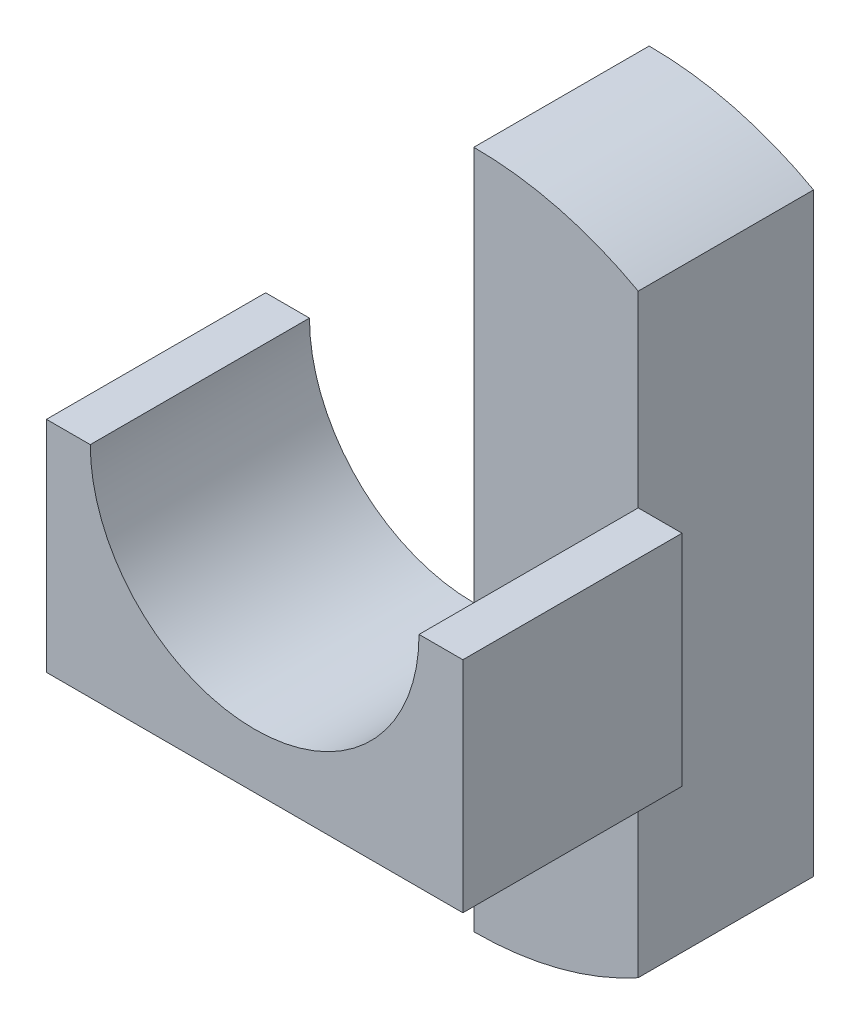
ISO-10303-21;
HEADER;
FILE_DESCRIPTION(('STEP AP214'),'2;1');
FILE_NAME('part.step','',(''),(''),'','','');
FILE_SCHEMA(('AUTOMOTIVE_DESIGN { 1 0 10303 214 1 1 1 1 }'));
ENDSEC;
DATA;
#1=APPLICATION_CONTEXT('core data for automotive mechanical design processes');
#2=APPLICATION_PROTOCOL_DEFINITION('international standard','automotive_design',2000,#1);
#3=PRODUCT_CONTEXT('',#1,'mechanical');
#4=PRODUCT('Part','Part','',(#3));
#5=PRODUCT_RELATED_PRODUCT_CATEGORY('part','',(#4));
#6=PRODUCT_DEFINITION_FORMATION('','',#4);
#7=PRODUCT_DEFINITION_CONTEXT('part definition',#1,'design');
#8=PRODUCT_DEFINITION('design','',#6,#7);
#9=PRODUCT_DEFINITION_SHAPE('','',#8);
#10=(LENGTH_UNIT() NAMED_UNIT(*) SI_UNIT(.MILLI.,.METRE.));
#11=(NAMED_UNIT(*) PLANE_ANGLE_UNIT() SI_UNIT($,.RADIAN.));
#12=(NAMED_UNIT(*) SI_UNIT($,.STERADIAN.) SOLID_ANGLE_UNIT());
#13=UNCERTAINTY_MEASURE_WITH_UNIT(LENGTH_MEASURE(1.E-05),#10,'distance_accuracy_value','');
#14=(GEOMETRIC_REPRESENTATION_CONTEXT(3) GLOBAL_UNCERTAINTY_ASSIGNED_CONTEXT((#13)) GLOBAL_UNIT_ASSIGNED_CONTEXT((#10,
#11,#12)) REPRESENTATION_CONTEXT('',''));
#15=CARTESIAN_POINT('',(0.,0.,0.));
#16=DIRECTION('',(0.,0.,1.));
#17=DIRECTION('',(1.,0.,0.));
#18=AXIS2_PLACEMENT_3D('',#15,#16,#17);
#19=CARTESIAN_POINT('',(0.,0.,8.));
#20=DIRECTION('',(0.,0.,-1.));
#21=DIRECTION('',(-1.,0.,0.));
#22=AXIS2_PLACEMENT_3D('',#19,#20,#21);
#23=PLANE('',#22);
#24=DIRECTION('',(1.,0.,0.));
#25=VECTOR('',#24,1.);
#26=CARTESIAN_POINT('',(0.,-5.,8.));
#27=LINE('',#26,#25);
#28=CARTESIAN_POINT('',(0.,-5.,8.));
#29=VERTEX_POINT('',#28);
#30=CARTESIAN_POINT('',(7.50000000000001,-5.,8.));
#31=VERTEX_POINT('',#30);
#32=EDGE_CURVE('E11',#29,#31,#27,.T.);
#33=ORIENTED_EDGE('',*,*,#32,.F.);
#34=DIRECTION('',(0.,-1.,0.));
#35=VECTOR('',#34,1.);
#36=CARTESIAN_POINT('',(0.,15.5,8.));
#37=LINE('',#36,#35);
#38=CARTESIAN_POINT('',(0.,-15.5,8.));
#39=VERTEX_POINT('',#38);
#40=EDGE_CURVE('E63',#29,#39,#37,.T.);
#41=ORIENTED_EDGE('',*,*,#40,.T.);
#42=CARTESIAN_POINT('',(0.,0.,8.));
#43=DIRECTION('',(0.,0.,1.));
#44=DIRECTION('',(-1.,0.,0.));
#45=AXIS2_PLACEMENT_3D('',#42,#43,#44);
#46=CIRCLE('',#45,15.5);
#47=CARTESIAN_POINT('',(7.50000000000001,-13.5646599662505,8.));
#48=VERTEX_POINT('',#47);
#49=EDGE_CURVE('E169',#39,#48,#46,.T.);
#50=ORIENTED_EDGE('',*,*,#49,.T.);
#51=DIRECTION('',(0.,1.,0.));
#52=VECTOR('',#51,1.);
#53=CARTESIAN_POINT('',(7.50000000000001,-13.5646599662505,8.));
#54=LINE('',#53,#52);
#55=EDGE_CURVE('E93',#48,#31,#54,.T.);
#56=ORIENTED_EDGE('',*,*,#55,.T.);
#57=EDGE_LOOP('',(#33,#41,#50,#56));
#58=FACE_BOUND('',#57,.T.);
#59=ADVANCED_FACE('F35',(#58),#23,.F.);
#60=CARTESIAN_POINT('',(0.,0.,8.));
#61=DIRECTION('',(0.,0.,-1.));
#62=DIRECTION('',(-1.,0.,0.));
#63=AXIS2_PLACEMENT_3D('',#60,#61,#62);
#64=CYLINDRICAL_SURFACE('',#63,15.5);
#65=CARTESIAN_POINT('',(0.,0.,0.));
#66=DIRECTION('',(0.,0.,1.));
#67=DIRECTION('',(-1.,0.,0.));
#68=AXIS2_PLACEMENT_3D('',#65,#66,#67);
#69=CIRCLE('',#68,15.5);
#70=CARTESIAN_POINT('',(0.,-15.5,0.));
#71=VERTEX_POINT('',#70);
#72=CARTESIAN_POINT('',(7.50000000000001,-13.5646599662505,0.));
#73=VERTEX_POINT('',#72);
#74=EDGE_CURVE('E160',#71,#73,#69,.T.);
#75=ORIENTED_EDGE('',*,*,#74,.T.);
#76=DIRECTION('',(0.,0.,-1.));
#77=VECTOR('',#76,1.);
#78=CARTESIAN_POINT('',(7.50000000000001,-13.5646599662505,8.));
#79=LINE('',#78,#77);
#80=EDGE_CURVE('E39',#48,#73,#79,.T.);
#81=ORIENTED_EDGE('',*,*,#80,.F.);
#82=ORIENTED_EDGE('',*,*,#49,.F.);
#83=DIRECTION('',(0.,0.,-1.));
#84=VECTOR('',#83,1.);
#85=CARTESIAN_POINT('',(0.,-15.5,8.));
#86=LINE('',#85,#84);
#87=EDGE_CURVE('E178',#39,#71,#86,.T.);
#88=ORIENTED_EDGE('',*,*,#87,.T.);
#89=EDGE_LOOP('',(#75,#81,#82,#88));
#90=FACE_BOUND('',#89,.T.);
#91=ADVANCED_FACE('F37',(#90),#64,.T.);
#92=CARTESIAN_POINT('',(7.50000000000001,-13.5646599662505,8.));
#93=DIRECTION('',(-1.,0.,0.));
#94=DIRECTION('',(0.,-1.,0.));
#95=AXIS2_PLACEMENT_3D('',#92,#93,#94);
#96=PLANE('',#95);
#97=DIRECTION('',(0.,1.,0.));
#98=VECTOR('',#97,1.);
#99=CARTESIAN_POINT('',(7.50000000000001,-13.5646599662505,0.));
#100=LINE('',#99,#98);
#101=CARTESIAN_POINT('',(7.50000000000001,13.5646599662505,0.));
#102=VERTEX_POINT('',#101);
#103=EDGE_CURVE('E163',#73,#102,#100,.T.);
#104=ORIENTED_EDGE('',*,*,#103,.T.);
#105=DIRECTION('',(0.,0.,-1.));
#106=VECTOR('',#105,1.);
#107=CARTESIAN_POINT('',(7.50000000000001,13.5646599662505,8.));
#108=LINE('',#107,#106);
#109=CARTESIAN_POINT('',(7.50000000000001,13.5646599662505,8.));
#110=VERTEX_POINT('',#109);
#111=EDGE_CURVE('E187',#110,#102,#108,.T.);
#112=ORIENTED_EDGE('',*,*,#111,.F.);
#113=CARTESIAN_POINT('',(7.50000000000001,5.,8.));
#114=VERTEX_POINT('',#113);
#115=EDGE_CURVE('E171',#114,#110,#54,.T.);
#116=ORIENTED_EDGE('',*,*,#115,.F.);
#117=EDGE_CURVE('E174',#31,#114,#54,.T.);
#118=ORIENTED_EDGE('',*,*,#117,.F.);
#119=ORIENTED_EDGE('',*,*,#55,.F.);
#120=ORIENTED_EDGE('',*,*,#80,.T.);
#121=EDGE_LOOP('',(#104,#112,#116,#118,#119,#120));
#122=FACE_BOUND('',#121,.T.);
#123=ADVANCED_FACE('F242',(#122),#96,.F.);
#124=CARTESIAN_POINT('',(0.,0.,8.));
#125=DIRECTION('',(0.,0.,-1.));
#126=DIRECTION('',(-1.,0.,0.));
#127=AXIS2_PLACEMENT_3D('',#124,#125,#126);
#128=CYLINDRICAL_SURFACE('',#127,15.5);
#129=CARTESIAN_POINT('',(0.,0.,0.));
#130=DIRECTION('',(0.,0.,1.));
#131=DIRECTION('',(-1.,0.,0.));
#132=AXIS2_PLACEMENT_3D('',#129,#130,#131);
#133=CIRCLE('',#132,15.5);
#134=CARTESIAN_POINT('',(0.,15.5,0.));
#135=VERTEX_POINT('',#134);
#136=EDGE_CURVE('E182',#102,#135,#133,.T.);
#137=ORIENTED_EDGE('',*,*,#136,.T.);
#138=DIRECTION('',(0.,0.,-1.));
#139=VECTOR('',#138,1.);
#140=CARTESIAN_POINT('',(0.,15.5,8.));
#141=LINE('',#140,#139);
#142=CARTESIAN_POINT('',(0.,15.5,8.));
#143=VERTEX_POINT('',#142);
#144=EDGE_CURVE('E186',#143,#135,#141,.T.);
#145=ORIENTED_EDGE('',*,*,#144,.F.);
#146=CARTESIAN_POINT('',(0.,0.,8.));
#147=DIRECTION('',(0.,0.,1.));
#148=DIRECTION('',(-1.,0.,0.));
#149=AXIS2_PLACEMENT_3D('',#146,#147,#148);
#150=CIRCLE('',#149,15.5);
#151=EDGE_CURVE('E173',#110,#143,#150,.T.);
#152=ORIENTED_EDGE('',*,*,#151,.F.);
#153=ORIENTED_EDGE('',*,*,#111,.T.);
#154=EDGE_LOOP('',(#137,#145,#152,#153));
#155=FACE_BOUND('',#154,.T.);
#156=ADVANCED_FACE('F243',(#155),#128,.T.);
#157=CARTESIAN_POINT('',(0.,15.5,8.));
#158=DIRECTION('',(1.,0.,0.));
#159=DIRECTION('',(0.,1.,0.));
#160=AXIS2_PLACEMENT_3D('',#157,#158,#159);
#161=PLANE('',#160);
#162=DIRECTION('',(0.,-1.,0.));
#163=VECTOR('',#162,1.);
#164=CARTESIAN_POINT('',(0.,15.5,0.));
#165=LINE('',#164,#163);
#166=EDGE_CURVE('E85',#135,#71,#165,.T.);
#167=ORIENTED_EDGE('',*,*,#166,.T.);
#168=ORIENTED_EDGE('',*,*,#87,.F.);
#169=ORIENTED_EDGE('',*,*,#40,.F.);
#170=CARTESIAN_POINT('',(0.,-2.5,8.));
#171=VERTEX_POINT('',#170);
#172=EDGE_CURVE('E179',#171,#29,#37,.T.);
#173=ORIENTED_EDGE('',*,*,#172,.F.);
#174=EDGE_CURVE('E176',#143,#171,#37,.T.);
#175=ORIENTED_EDGE('',*,*,#174,.F.);
#176=ORIENTED_EDGE('',*,*,#144,.T.);
#177=EDGE_LOOP('',(#167,#168,#169,#173,#175,#176));
#178=FACE_BOUND('',#177,.T.);
#179=ADVANCED_FACE('F245',(#178),#161,.F.);
#180=ORIENTED_EDGE('',*,*,#174,.T.);
#181=CARTESIAN_POINT('',(0.,5.,8.));
#182=DIRECTION('',(0.,0.,1.));
#183=DIRECTION('',(1.,0.,0.));
#184=AXIS2_PLACEMENT_3D('',#181,#182,#183);
#185=CIRCLE('',#184,7.5);
#186=EDGE_CURVE('E44',#171,#114,#185,.T.);
#187=ORIENTED_EDGE('',*,*,#186,.T.);
#188=ORIENTED_EDGE('',*,*,#115,.T.);
#189=ORIENTED_EDGE('',*,*,#151,.T.);
#190=EDGE_LOOP('',(#180,#187,#188,#189));
#191=FACE_BOUND('',#190,.T.);
#192=ADVANCED_FACE('F240',(#191),#23,.F.);
#193=CARTESIAN_POINT('',(0.,0.,0.));
#194=DIRECTION('',(0.,0.,-1.));
#195=DIRECTION('',(-1.,0.,0.));
#196=AXIS2_PLACEMENT_3D('',#193,#194,#195);
#197=PLANE('',#196);
#198=ORIENTED_EDGE('',*,*,#74,.F.);
#199=ORIENTED_EDGE('',*,*,#166,.F.);
#200=ORIENTED_EDGE('',*,*,#136,.F.);
#201=ORIENTED_EDGE('',*,*,#103,.F.);
#202=EDGE_LOOP('',(#198,#199,#200,#201));
#203=FACE_BOUND('',#202,.T.);
#204=ADVANCED_FACE('F251',(#203),#197,.T.);
#205=CARTESIAN_POINT('',(0.,0.,8.));
#206=DIRECTION('',(0.,0.,1.));
#207=DIRECTION('',(1.,0.,0.));
#208=AXIS2_PLACEMENT_3D('',#205,#206,#207);
#209=PLANE('',#208);
#210=CARTESIAN_POINT('',(9.50000000000001,-5.,8.));
#211=VERTEX_POINT('',#210);
#212=EDGE_CURVE('E47',#31,#211,#27,.T.);
#213=ORIENTED_EDGE('',*,*,#212,.F.);
#214=ORIENTED_EDGE('',*,*,#117,.T.);
#215=DIRECTION('',(-1.,0.,0.));
#216=VECTOR('',#215,1.);
#217=CARTESIAN_POINT('',(0.,5.,8.));
#218=LINE('',#217,#216);
#219=CARTESIAN_POINT('',(9.50000000000001,5.,8.));
#220=VERTEX_POINT('',#219);
#221=EDGE_CURVE('E54',#220,#114,#218,.T.);
#222=ORIENTED_EDGE('',*,*,#221,.F.);
#223=DIRECTION('',(0.,1.,0.));
#224=VECTOR('',#223,1.);
#225=CARTESIAN_POINT('',(9.50000000000001,0.,8.));
#226=LINE('',#225,#224);
#227=EDGE_CURVE('E159',#211,#220,#226,.T.);
#228=ORIENTED_EDGE('',*,*,#227,.F.);
#229=EDGE_LOOP('',(#213,#214,#222,#228));
#230=FACE_BOUND('',#229,.T.);
#231=ADVANCED_FACE('F239',(#230),#209,.F.);
#232=CARTESIAN_POINT('',(-7.5,5.,8.));
#233=VERTEX_POINT('',#232);
#234=EDGE_CURVE('E196',#233,#171,#185,.T.);
#235=ORIENTED_EDGE('',*,*,#234,.T.);
#236=ORIENTED_EDGE('',*,*,#172,.T.);
#237=CARTESIAN_POINT('',(-9.5,-5.,8.));
#238=VERTEX_POINT('',#237);
#239=EDGE_CURVE('E46',#238,#29,#27,.T.);
#240=ORIENTED_EDGE('',*,*,#239,.F.);
#241=DIRECTION('',(0.,1.,0.));
#242=VECTOR('',#241,1.);
#243=CARTESIAN_POINT('',(-9.5,0.,8.));
#244=LINE('',#243,#242);
#245=CARTESIAN_POINT('',(-9.50000000000001,5.,8.));
#246=VERTEX_POINT('',#245);
#247=EDGE_CURVE('E207',#238,#246,#244,.T.);
#248=ORIENTED_EDGE('',*,*,#247,.T.);
#249=DIRECTION('',(1.,0.,0.));
#250=VECTOR('',#249,1.);
#251=CARTESIAN_POINT('',(0.,5.,8.));
#252=LINE('',#251,#250);
#253=EDGE_CURVE('E202',#246,#233,#252,.T.);
#254=ORIENTED_EDGE('',*,*,#253,.T.);
#255=EDGE_LOOP('',(#235,#236,#240,#248,#254));
#256=FACE_BOUND('',#255,.T.);
#257=ADVANCED_FACE('F246',(#256),#209,.F.);
#258=CARTESIAN_POINT('',(9.50000000000001,0.,18.));
#259=DIRECTION('',(-1.,0.,0.));
#260=DIRECTION('',(0.,0.,1.));
#261=AXIS2_PLACEMENT_3D('',#258,#259,#260);
#262=PLANE('',#261);
#263=ORIENTED_EDGE('',*,*,#227,.T.);
#264=DIRECTION('',(0.,0.,-1.));
#265=VECTOR('',#264,1.);
#266=CARTESIAN_POINT('',(9.50000000000001,5.,18.));
#267=LINE('',#266,#265);
#268=CARTESIAN_POINT('',(9.50000000000001,5.,18.));
#269=VERTEX_POINT('',#268);
#270=EDGE_CURVE('E139',#269,#220,#267,.T.);
#271=ORIENTED_EDGE('',*,*,#270,.F.);
#272=DIRECTION('',(0.,1.,0.));
#273=VECTOR('',#272,1.);
#274=CARTESIAN_POINT('',(9.50000000000001,0.,18.));
#275=LINE('',#274,#273);
#276=CARTESIAN_POINT('',(9.50000000000001,-5.,18.));
#277=VERTEX_POINT('',#276);
#278=EDGE_CURVE('E146',#277,#269,#275,.T.);
#279=ORIENTED_EDGE('',*,*,#278,.F.);
#280=DIRECTION('',(0.,0.,-1.));
#281=VECTOR('',#280,1.);
#282=CARTESIAN_POINT('',(9.50000000000001,-5.,18.));
#283=LINE('',#282,#281);
#284=EDGE_CURVE('E211',#277,#211,#283,.T.);
#285=ORIENTED_EDGE('',*,*,#284,.T.);
#286=EDGE_LOOP('',(#263,#271,#279,#285));
#287=FACE_BOUND('',#286,.T.);
#288=ADVANCED_FACE('F157',(#287),#262,.F.);
#289=CARTESIAN_POINT('',(0.,5.,18.));
#290=DIRECTION('',(0.,-1.,0.));
#291=DIRECTION('',(0.,0.,-1.));
#292=AXIS2_PLACEMENT_3D('',#289,#290,#291);
#293=PLANE('',#292);
#294=ORIENTED_EDGE('',*,*,#221,.T.);
#295=DIRECTION('',(0.,0.,-1.));
#296=VECTOR('',#295,1.);
#297=CARTESIAN_POINT('',(7.50000000000001,5.,18.));
#298=LINE('',#297,#296);
#299=CARTESIAN_POINT('',(7.50000000000001,5.,18.));
#300=VERTEX_POINT('',#299);
#301=EDGE_CURVE('E141',#300,#114,#298,.T.);
#302=ORIENTED_EDGE('',*,*,#301,.F.);
#303=DIRECTION('',(-1.,0.,0.));
#304=VECTOR('',#303,1.);
#305=CARTESIAN_POINT('',(0.,5.,18.));
#306=LINE('',#305,#304);
#307=EDGE_CURVE('E135',#269,#300,#306,.T.);
#308=ORIENTED_EDGE('',*,*,#307,.F.);
#309=ORIENTED_EDGE('',*,*,#270,.T.);
#310=EDGE_LOOP('',(#294,#302,#308,#309));
#311=FACE_BOUND('',#310,.T.);
#312=ADVANCED_FACE('F137',(#311),#293,.F.);
#313=CARTESIAN_POINT('',(0.,5.,18.));
#314=DIRECTION('',(0.,0.,-1.));
#315=DIRECTION('',(-1.,0.,0.));
#316=AXIS2_PLACEMENT_3D('',#313,#314,#315);
#317=CYLINDRICAL_SURFACE('',#316,7.5);
#318=ORIENTED_EDGE('',*,*,#234,.F.);
#319=DIRECTION('',(0.,0.,-1.));
#320=VECTOR('',#319,1.);
#321=CARTESIAN_POINT('',(-7.5,5.,18.));
#322=LINE('',#321,#320);
#323=CARTESIAN_POINT('',(-7.5,5.,18.));
#324=VERTEX_POINT('',#323);
#325=EDGE_CURVE('E165',#324,#233,#322,.T.);
#326=ORIENTED_EDGE('',*,*,#325,.F.);
#327=CARTESIAN_POINT('',(0.,5.,18.));
#328=DIRECTION('',(0.,0.,1.));
#329=DIRECTION('',(1.,0.,0.));
#330=AXIS2_PLACEMENT_3D('',#327,#328,#329);
#331=CIRCLE('',#330,7.5);
#332=EDGE_CURVE('E145',#324,#300,#331,.T.);
#333=ORIENTED_EDGE('',*,*,#332,.T.);
#334=ORIENTED_EDGE('',*,*,#301,.T.);
#335=ORIENTED_EDGE('',*,*,#186,.F.);
#336=EDGE_LOOP('',(#318,#326,#333,#334,#335));
#337=FACE_BOUND('',#336,.T.);
#338=ADVANCED_FACE('F219',(#337),#317,.F.);
#339=CARTESIAN_POINT('',(0.,5.,18.));
#340=DIRECTION('',(0.,1.,0.));
#341=DIRECTION('',(0.,0.,1.));
#342=AXIS2_PLACEMENT_3D('',#339,#340,#341);
#343=PLANE('',#342);
#344=ORIENTED_EDGE('',*,*,#253,.F.);
#345=DIRECTION('',(0.,0.,-1.));
#346=VECTOR('',#345,1.);
#347=CARTESIAN_POINT('',(-9.50000000000001,5.,18.));
#348=LINE('',#347,#346);
#349=CARTESIAN_POINT('',(-9.50000000000001,5.,18.));
#350=VERTEX_POINT('',#349);
#351=EDGE_CURVE('E225',#350,#246,#348,.T.);
#352=ORIENTED_EDGE('',*,*,#351,.F.);
#353=DIRECTION('',(1.,0.,0.));
#354=VECTOR('',#353,1.);
#355=CARTESIAN_POINT('',(0.,5.,18.));
#356=LINE('',#355,#354);
#357=EDGE_CURVE('E215',#350,#324,#356,.T.);
#358=ORIENTED_EDGE('',*,*,#357,.T.);
#359=ORIENTED_EDGE('',*,*,#325,.T.);
#360=EDGE_LOOP('',(#344,#352,#358,#359));
#361=FACE_BOUND('',#360,.T.);
#362=ADVANCED_FACE('F224',(#361),#343,.T.);
#363=CARTESIAN_POINT('',(-9.5,0.,18.));
#364=DIRECTION('',(-1.,0.,0.));
#365=DIRECTION('',(0.,-1.,0.));
#366=AXIS2_PLACEMENT_3D('',#363,#364,#365);
#367=PLANE('',#366);
#368=ORIENTED_EDGE('',*,*,#247,.F.);
#369=DIRECTION('',(0.,0.,-1.));
#370=VECTOR('',#369,1.);
#371=CARTESIAN_POINT('',(-9.5,-5.,18.));
#372=LINE('',#371,#370);
#373=CARTESIAN_POINT('',(-9.5,-5.,18.));
#374=VERTEX_POINT('',#373);
#375=EDGE_CURVE('E229',#374,#238,#372,.T.);
#376=ORIENTED_EDGE('',*,*,#375,.F.);
#377=DIRECTION('',(0.,1.,0.));
#378=VECTOR('',#377,1.);
#379=CARTESIAN_POINT('',(-9.5,0.,18.));
#380=LINE('',#379,#378);
#381=EDGE_CURVE('E212',#374,#350,#380,.T.);
#382=ORIENTED_EDGE('',*,*,#381,.T.);
#383=ORIENTED_EDGE('',*,*,#351,.T.);
#384=EDGE_LOOP('',(#368,#376,#382,#383));
#385=FACE_BOUND('',#384,.T.);
#386=ADVANCED_FACE('F274',(#385),#367,.T.);
#387=CARTESIAN_POINT('',(0.,-5.,18.));
#388=DIRECTION('',(0.,1.,0.));
#389=DIRECTION('',(0.,0.,1.));
#390=AXIS2_PLACEMENT_3D('',#387,#388,#389);
#391=PLANE('',#390);
#392=ORIENTED_EDGE('',*,*,#239,.T.);
#393=ORIENTED_EDGE('',*,*,#32,.T.);
#394=ORIENTED_EDGE('',*,*,#212,.T.);
#395=ORIENTED_EDGE('',*,*,#284,.F.);
#396=DIRECTION('',(1.,0.,0.));
#397=VECTOR('',#396,1.);
#398=CARTESIAN_POINT('',(0.,-5.,18.));
#399=LINE('',#398,#397);
#400=EDGE_CURVE('E152',#374,#277,#399,.T.);
#401=ORIENTED_EDGE('',*,*,#400,.F.);
#402=ORIENTED_EDGE('',*,*,#375,.T.);
#403=EDGE_LOOP('',(#392,#393,#394,#395,#401,#402));
#404=FACE_BOUND('',#403,.T.);
#405=ADVANCED_FACE('F237',(#404),#391,.F.);
#406=CARTESIAN_POINT('',(0.,0.,18.));
#407=DIRECTION('',(0.,0.,1.));
#408=DIRECTION('',(1.,0.,0.));
#409=AXIS2_PLACEMENT_3D('',#406,#407,#408);
#410=PLANE('',#409);
#411=ORIENTED_EDGE('',*,*,#278,.T.);
#412=ORIENTED_EDGE('',*,*,#307,.T.);
#413=ORIENTED_EDGE('',*,*,#332,.F.);
#414=ORIENTED_EDGE('',*,*,#357,.F.);
#415=ORIENTED_EDGE('',*,*,#381,.F.);
#416=ORIENTED_EDGE('',*,*,#400,.T.);
#417=EDGE_LOOP('',(#411,#412,#413,#414,#415,#416));
#418=FACE_BOUND('',#417,.T.);
#419=ADVANCED_FACE('F149',(#418),#410,.T.);
#420=CLOSED_SHELL('',(#59,#91,#123,#156,#179,#192,#204,#231,#257,#288,#312,#338,#362,#386,#405,#419));
#421=MANIFOLD_SOLID_BREP('B2',#420);
#422=ADVANCED_BREP_SHAPE_REPRESENTATION('',(#18,#421),#14);
#423=SHAPE_DEFINITION_REPRESENTATION(#9,#422);
ENDSEC;
END-ISO-10303-21;
